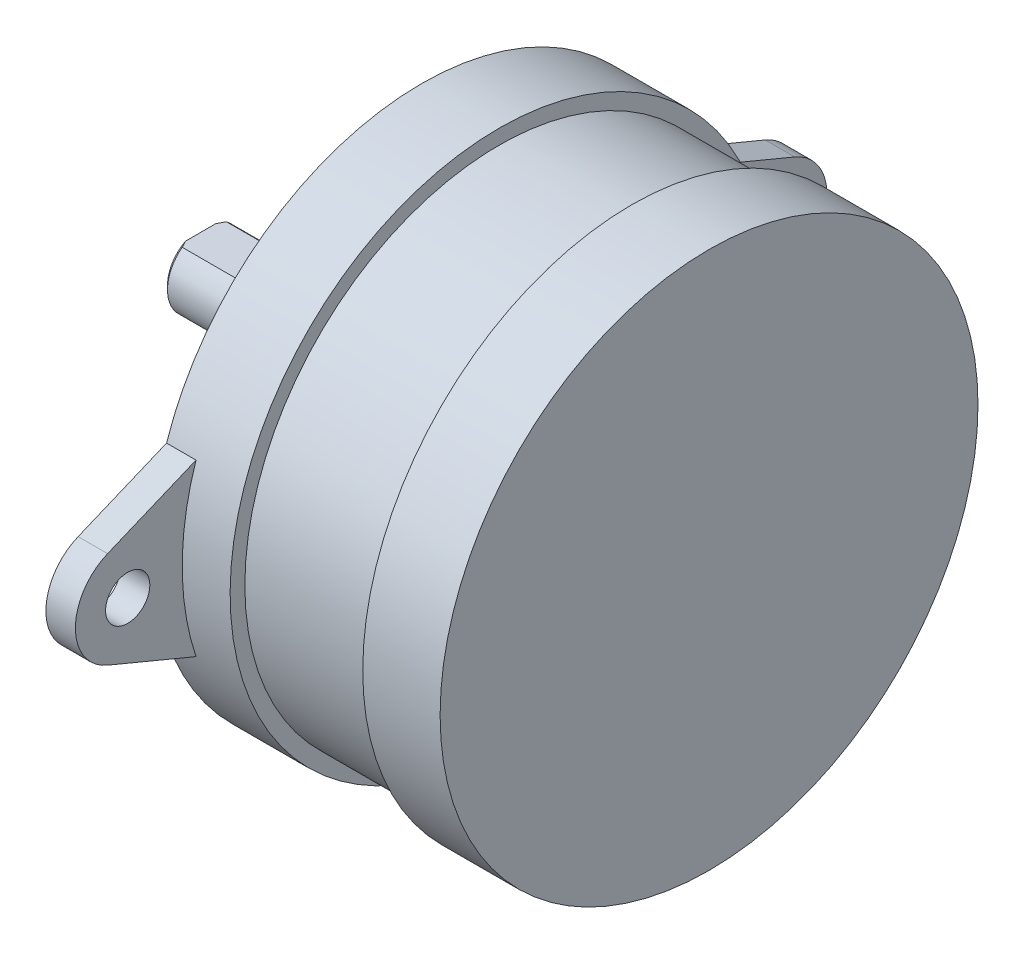
ISO-10303-21;
HEADER;
FILE_DESCRIPTION(('STEP AP214'),'2;1');
FILE_NAME('part.step','',(''),(''),'','','');
FILE_SCHEMA(('AUTOMOTIVE_DESIGN { 1 0 10303 214 1 1 1 1 }'));
ENDSEC;
DATA;
#1=APPLICATION_CONTEXT('core data for automotive mechanical design processes');
#2=APPLICATION_PROTOCOL_DEFINITION('international standard','automotive_design',2000,#1);
#3=PRODUCT_CONTEXT('',#1,'mechanical');
#4=PRODUCT('Part','Part','',(#3));
#5=PRODUCT_RELATED_PRODUCT_CATEGORY('part','',(#4));
#6=PRODUCT_DEFINITION_FORMATION('','',#4);
#7=PRODUCT_DEFINITION_CONTEXT('part definition',#1,'design');
#8=PRODUCT_DEFINITION('design','',#6,#7);
#9=PRODUCT_DEFINITION_SHAPE('','',#8);
#10=(LENGTH_UNIT() NAMED_UNIT(*) SI_UNIT(.MILLI.,.METRE.));
#11=(NAMED_UNIT(*) PLANE_ANGLE_UNIT() SI_UNIT($,.RADIAN.));
#12=(NAMED_UNIT(*) SI_UNIT($,.STERADIAN.) SOLID_ANGLE_UNIT());
#13=UNCERTAINTY_MEASURE_WITH_UNIT(LENGTH_MEASURE(1.E-05),#10,'distance_accuracy_value','');
#14=(GEOMETRIC_REPRESENTATION_CONTEXT(3) GLOBAL_UNCERTAINTY_ASSIGNED_CONTEXT((#13)) GLOBAL_UNIT_ASSIGNED_CONTEXT((#10,
#11,#12)) REPRESENTATION_CONTEXT('',''));
#15=CARTESIAN_POINT('',(0.,0.,0.));
#16=DIRECTION('',(0.,0.,1.));
#17=DIRECTION('',(1.,0.,0.));
#18=AXIS2_PLACEMENT_3D('',#15,#16,#17);
#19=CARTESIAN_POINT('',(5.25,0.,0.));
#20=DIRECTION('',(-1.,0.,0.));
#21=DIRECTION('',(0.,0.,1.));
#22=AXIS2_PLACEMENT_3D('',#19,#20,#21);
#23=CYLINDRICAL_SURFACE('',#22,18.25);
#24=CARTESIAN_POINT('',(5.25,0.,0.));
#25=DIRECTION('',(1.,0.,0.));
#26=DIRECTION('',(0.,0.,-1.));
#27=AXIS2_PLACEMENT_3D('',#24,#25,#26);
#28=CIRCLE('',#27,18.25);
#29=CARTESIAN_POINT('',(5.25,0.,-18.25));
#30=VERTEX_POINT('',#29);
#31=EDGE_CURVE('E233',#30,#30,#28,.T.);
#32=ORIENTED_EDGE('',*,*,#31,.F.);
#33=EDGE_LOOP('',(#32));
#34=FACE_BOUND('',#33,.T.);
#35=DIRECTION('',(-1.,0.,0.));
#36=VECTOR('',#35,1.);
#37=CARTESIAN_POINT('',(2.,5.77449333336406,-17.3123576309795));
#38=LINE('',#37,#36);
#39=CARTESIAN_POINT('',(2.,5.77449333336406,-17.3123576309795));
#40=VERTEX_POINT('',#39);
#41=CARTESIAN_POINT('',(0.,5.77449333336406,-17.3123576309795));
#42=VERTEX_POINT('',#41);
#43=EDGE_CURVE('E236',#40,#42,#38,.T.);
#44=ORIENTED_EDGE('',*,*,#43,.T.);
#45=CARTESIAN_POINT('',(0.,0.,0.));
#46=DIRECTION('',(1.,0.,0.));
#47=DIRECTION('',(0.,0.,-1.));
#48=AXIS2_PLACEMENT_3D('',#45,#46,#47);
#49=CIRCLE('',#48,18.25);
#50=CARTESIAN_POINT('',(0.,5.77449333336406,17.3123576309795));
#51=VERTEX_POINT('',#50);
#52=EDGE_CURVE('E238',#42,#51,#49,.T.);
#53=ORIENTED_EDGE('',*,*,#52,.T.);
#54=DIRECTION('',(-1.,0.,0.));
#55=VECTOR('',#54,1.);
#56=CARTESIAN_POINT('',(2.,5.77449333336406,17.3123576309795));
#57=LINE('',#56,#55);
#58=CARTESIAN_POINT('',(2.,5.77449333336406,17.3123576309795));
#59=VERTEX_POINT('',#58);
#60=EDGE_CURVE('E302',#59,#51,#57,.T.);
#61=ORIENTED_EDGE('',*,*,#60,.F.);
#62=CARTESIAN_POINT('',(2.,0.,0.));
#63=DIRECTION('',(-1.,0.,0.));
#64=DIRECTION('',(0.,0.,1.));
#65=AXIS2_PLACEMENT_3D('',#62,#63,#64);
#66=CIRCLE('',#65,18.25);
#67=CARTESIAN_POINT('',(2.,-5.77449333336406,17.3123576309795));
#68=VERTEX_POINT('',#67);
#69=EDGE_CURVE('E275',#68,#59,#66,.T.);
#70=ORIENTED_EDGE('',*,*,#69,.F.);
#71=DIRECTION('',(-1.,0.,0.));
#72=VECTOR('',#71,1.);
#73=CARTESIAN_POINT('',(2.,-5.77449333336406,17.3123576309795));
#74=LINE('',#73,#72);
#75=CARTESIAN_POINT('',(0.,-5.77449333336406,17.3123576309795));
#76=VERTEX_POINT('',#75);
#77=EDGE_CURVE('E299',#68,#76,#74,.T.);
#78=ORIENTED_EDGE('',*,*,#77,.T.);
#79=CARTESIAN_POINT('',(0.,-5.77449333336406,-17.3123576309795));
#80=VERTEX_POINT('',#79);
#81=EDGE_CURVE('E315',#76,#80,#49,.T.);
#82=ORIENTED_EDGE('',*,*,#81,.T.);
#83=DIRECTION('',(-1.,0.,0.));
#84=VECTOR('',#83,1.);
#85=CARTESIAN_POINT('',(2.,-5.77449333336406,-17.3123576309795));
#86=LINE('',#85,#84);
#87=CARTESIAN_POINT('',(2.,-5.77449333336406,-17.3123576309795));
#88=VERTEX_POINT('',#87);
#89=EDGE_CURVE('E58',#88,#80,#86,.T.);
#90=ORIENTED_EDGE('',*,*,#89,.F.);
#91=CARTESIAN_POINT('',(2.,0.,0.));
#92=DIRECTION('',(-1.,0.,0.));
#93=DIRECTION('',(0.,0.,1.));
#94=AXIS2_PLACEMENT_3D('',#91,#92,#93);
#95=CIRCLE('',#94,18.25);
#96=EDGE_CURVE('E240',#40,#88,#95,.T.);
#97=ORIENTED_EDGE('',*,*,#96,.F.);
#98=EDGE_LOOP('',(#44,#53,#61,#70,#78,#82,#90,#97));
#99=FACE_BOUND('',#98,.T.);
#100=ADVANCED_FACE('F34',(#34,#99),#23,.T.);
#101=CARTESIAN_POINT('',(5.25,0.,0.));
#102=DIRECTION('',(1.,0.,0.));
#103=DIRECTION('',(0.,0.,-1.));
#104=AXIS2_PLACEMENT_3D('',#101,#102,#103);
#105=PLANE('',#104);
#106=CARTESIAN_POINT('',(5.25,0.,0.));
#107=DIRECTION('',(1.,0.,0.));
#108=DIRECTION('',(0.,0.,-1.));
#109=AXIS2_PLACEMENT_3D('',#106,#107,#108);
#110=CIRCLE('',#109,17.25);
#111=CARTESIAN_POINT('',(5.25,0.,-17.25));
#112=VERTEX_POINT('',#111);
#113=EDGE_CURVE('E136',#112,#112,#110,.T.);
#114=ORIENTED_EDGE('',*,*,#113,.F.);
#115=EDGE_LOOP('',(#114));
#116=FACE_BOUND('',#115,.T.);
#117=ORIENTED_EDGE('',*,*,#31,.T.);
#118=EDGE_LOOP('',(#117));
#119=FACE_BOUND('',#118,.T.);
#120=ADVANCED_FACE('F221',(#116,#119),#105,.T.);
#121=CARTESIAN_POINT('',(0.,0.,0.));
#122=DIRECTION('',(1.,0.,0.));
#123=DIRECTION('',(0.,0.,-1.));
#124=AXIS2_PLACEMENT_3D('',#121,#122,#123);
#125=PLANE('',#124);
#126=CARTESIAN_POINT('',(0.,0.,0.));
#127=DIRECTION('',(-1.,0.,0.));
#128=DIRECTION('',(0.,0.,1.));
#129=AXIS2_PLACEMENT_3D('',#126,#127,#128);
#130=CIRCLE('',#129,8.);
#131=CARTESIAN_POINT('',(0.,0.,8.));
#132=VERTEX_POINT('',#131);
#133=EDGE_CURVE('E132',#132,#132,#130,.T.);
#134=ORIENTED_EDGE('',*,*,#133,.F.);
#135=EDGE_LOOP('',(#134));
#136=FACE_BOUND('',#135,.T.);
#137=ORIENTED_EDGE('',*,*,#81,.F.);
#138=DIRECTION('',(0.,-0.384131557483133,-0.92327836893625));
#139=VECTOR('',#138,1.);
#140=CARTESIAN_POINT('',(0.,-11.0624330645305,4.60254435238959));
#141=LINE('',#140,#139);
#142=CARTESIAN_POINT('',(0.,-3.27763820972369,23.3136670290651));
#143=VERTEX_POINT('',#142);
#144=EDGE_CURVE('E290',#143,#76,#141,.T.);
#145=ORIENTED_EDGE('',*,*,#144,.F.);
#146=CARTESIAN_POINT('',(0.,0.,21.95));
#147=DIRECTION('',(-1.,0.,0.));
#148=DIRECTION('',(0.,0.,1.));
#149=AXIS2_PLACEMENT_3D('',#146,#147,#148);
#150=CIRCLE('',#149,3.55);
#151=CARTESIAN_POINT('',(0.,3.27763820972369,23.3136670290651));
#152=VERTEX_POINT('',#151);
#153=EDGE_CURVE('E243',#152,#143,#150,.F.);
#154=ORIENTED_EDGE('',*,*,#153,.F.);
#155=DIRECTION('',(0.,0.384131557483133,-0.92327836893625));
#156=VECTOR('',#155,1.);
#157=CARTESIAN_POINT('',(0.,11.0624330645305,4.60254435238959));
#158=LINE('',#157,#156);
#159=EDGE_CURVE('E287',#152,#51,#158,.T.);
#160=ORIENTED_EDGE('',*,*,#159,.T.);
#161=ORIENTED_EDGE('',*,*,#52,.F.);
#162=DIRECTION('',(0.,0.384131557483133,0.92327836893625));
#163=VECTOR('',#162,1.);
#164=CARTESIAN_POINT('',(0.,11.0624330645305,-4.60254435238959));
#165=LINE('',#164,#163);
#166=CARTESIAN_POINT('',(0.,3.27763820972369,-23.3136670290651));
#167=VERTEX_POINT('',#166);
#168=EDGE_CURVE('E246',#167,#42,#165,.T.);
#169=ORIENTED_EDGE('',*,*,#168,.F.);
#170=CARTESIAN_POINT('',(0.,0.,-21.95));
#171=DIRECTION('',(-1.,0.,0.));
#172=DIRECTION('',(0.,0.,1.));
#173=AXIS2_PLACEMENT_3D('',#170,#171,#172);
#174=CIRCLE('',#173,3.55);
#175=CARTESIAN_POINT('',(0.,-3.27763820972369,-23.3136670290651));
#176=VERTEX_POINT('',#175);
#177=EDGE_CURVE('E251',#167,#176,#174,.T.);
#178=ORIENTED_EDGE('',*,*,#177,.T.);
#179=DIRECTION('',(0.,-0.384131557483133,0.92327836893625));
#180=VECTOR('',#179,1.);
#181=CARTESIAN_POINT('',(0.,-11.0624330645305,-4.60254435238959));
#182=LINE('',#181,#180);
#183=EDGE_CURVE('E254',#176,#80,#182,.T.);
#184=ORIENTED_EDGE('',*,*,#183,.T.);
#185=EDGE_LOOP('',(#137,#145,#154,#160,#161,#169,#178,#184));
#186=FACE_BOUND('',#185,.T.);
#187=CARTESIAN_POINT('',(0.,0.,21.95));
#188=DIRECTION('',(-1.,0.,0.));
#189=DIRECTION('',(0.,0.,1.));
#190=AXIS2_PLACEMENT_3D('',#187,#188,#189);
#191=CIRCLE('',#190,1.5);
#192=CARTESIAN_POINT('',(0.,0.,23.45));
#193=VERTEX_POINT('',#192);
#194=EDGE_CURVE('E272',#193,#193,#191,.T.);
#195=ORIENTED_EDGE('',*,*,#194,.F.);
#196=EDGE_LOOP('',(#195));
#197=FACE_BOUND('',#196,.T.);
#198=CARTESIAN_POINT('',(0.,0.,-21.95));
#199=DIRECTION('',(-1.,0.,0.));
#200=DIRECTION('',(0.,0.,1.));
#201=AXIS2_PLACEMENT_3D('',#198,#199,#200);
#202=CIRCLE('',#201,1.5);
#203=CARTESIAN_POINT('',(0.,0.,-20.45));
#204=VERTEX_POINT('',#203);
#205=EDGE_CURVE('E252',#204,#204,#202,.F.);
#206=ORIENTED_EDGE('',*,*,#205,.T.);
#207=EDGE_LOOP('',(#206));
#208=FACE_BOUND('',#207,.T.);
#209=ADVANCED_FACE('F219',(#136,#186,#197,#208),#125,.F.);
#210=CARTESIAN_POINT('',(14.25,0.,0.));
#211=DIRECTION('',(-1.,0.,0.));
#212=DIRECTION('',(0.,0.,1.));
#213=AXIS2_PLACEMENT_3D('',#210,#211,#212);
#214=CYLINDRICAL_SURFACE('',#213,17.25);
#215=CARTESIAN_POINT('',(14.25,0.,0.));
#216=DIRECTION('',(1.,0.,0.));
#217=DIRECTION('',(0.,0.,-1.));
#218=AXIS2_PLACEMENT_3D('',#215,#216,#217);
#219=CIRCLE('',#218,17.25);
#220=CARTESIAN_POINT('',(14.25,0.,-17.25));
#221=VERTEX_POINT('',#220);
#222=EDGE_CURVE('E308',#221,#221,#219,.T.);
#223=ORIENTED_EDGE('',*,*,#222,.F.);
#224=EDGE_LOOP('',(#223));
#225=FACE_BOUND('',#224,.T.);
#226=ORIENTED_EDGE('',*,*,#113,.T.);
#227=EDGE_LOOP('',(#226));
#228=FACE_BOUND('',#227,.T.);
#229=ADVANCED_FACE('F215',(#225,#228),#214,.T.);
#230=CARTESIAN_POINT('',(19.5,0.,0.));
#231=DIRECTION('',(-1.,0.,0.));
#232=DIRECTION('',(0.,0.,1.));
#233=AXIS2_PLACEMENT_3D('',#230,#231,#232);
#234=CYLINDRICAL_SURFACE('',#233,18.25);
#235=CARTESIAN_POINT('',(19.5,0.,0.));
#236=DIRECTION('',(1.,0.,0.));
#237=DIRECTION('',(0.,0.,-1.));
#238=AXIS2_PLACEMENT_3D('',#235,#236,#237);
#239=CIRCLE('',#238,18.25);
#240=CARTESIAN_POINT('',(19.5,0.,18.25));
#241=VERTEX_POINT('',#240);
#242=EDGE_CURVE('E305',#241,#241,#239,.T.);
#243=CARTESIAN_POINT('',(14.25,0.,0.));
#244=DIRECTION('',(1.,0.,0.));
#245=DIRECTION('',(0.,0.,-1.));
#246=AXIS2_PLACEMENT_3D('',#243,#244,#245);
#247=CIRCLE('',#246,18.25);
#248=CARTESIAN_POINT('',(14.25,0.,18.25));
#249=VERTEX_POINT('',#248);
#250=EDGE_CURVE('E298',#249,#249,#247,.T.);
#251=CARTESIAN_POINT('',(19.5,0.,18.25));
#252=CARTESIAN_POINT('',(19.4453125,0.,18.25));
#253=CARTESIAN_POINT('',(19.390625,0.,18.25));
#254=CARTESIAN_POINT('',(19.28125,0.,18.25));
#255=CARTESIAN_POINT('',(19.2265625,0.,18.25));
#256=CARTESIAN_POINT('',(19.1171875,0.,18.25));
#257=CARTESIAN_POINT('',(19.0625,0.,18.25));
#258=CARTESIAN_POINT('',(18.953125,0.,18.25));
#259=CARTESIAN_POINT('',(18.8984375,0.,18.25));
#260=CARTESIAN_POINT('',(18.7890625,0.,18.25));
#261=CARTESIAN_POINT('',(18.734375,0.,18.25));
#262=CARTESIAN_POINT('',(18.625,0.,18.25));
#263=CARTESIAN_POINT('',(18.5703125,0.,18.25));
#264=CARTESIAN_POINT('',(18.4609375,0.,18.25));
#265=CARTESIAN_POINT('',(18.40625,0.,18.25));
#266=CARTESIAN_POINT('',(18.296875,0.,18.25));
#267=CARTESIAN_POINT('',(18.2421875,0.,18.25));
#268=CARTESIAN_POINT('',(18.1328125,0.,18.25));
#269=CARTESIAN_POINT('',(18.078125,0.,18.25));
#270=CARTESIAN_POINT('',(17.96875,0.,18.25));
#271=CARTESIAN_POINT('',(17.9140625,0.,18.25));
#272=CARTESIAN_POINT('',(17.8046875,0.,18.25));
#273=CARTESIAN_POINT('',(17.75,0.,18.25));
#274=CARTESIAN_POINT('',(17.640625,0.,18.25));
#275=CARTESIAN_POINT('',(17.5859375,0.,18.25));
#276=CARTESIAN_POINT('',(17.4765625,0.,18.25));
#277=CARTESIAN_POINT('',(17.421875,0.,18.25));
#278=CARTESIAN_POINT('',(17.3125,0.,18.25));
#279=CARTESIAN_POINT('',(17.2578125,0.,18.25));
#280=CARTESIAN_POINT('',(17.1484375,0.,18.25));
#281=CARTESIAN_POINT('',(17.09375,0.,18.25));
#282=CARTESIAN_POINT('',(16.984375,0.,18.25));
#283=CARTESIAN_POINT('',(16.9296875,0.,18.25));
#284=CARTESIAN_POINT('',(16.8203125,0.,18.25));
#285=CARTESIAN_POINT('',(16.765625,0.,18.25));
#286=CARTESIAN_POINT('',(16.65625,0.,18.25));
#287=CARTESIAN_POINT('',(16.6015625,0.,18.25));
#288=CARTESIAN_POINT('',(16.4921875,0.,18.25));
#289=CARTESIAN_POINT('',(16.4375,0.,18.25));
#290=CARTESIAN_POINT('',(16.328125,0.,18.25));
#291=CARTESIAN_POINT('',(16.2734375,0.,18.25));
#292=CARTESIAN_POINT('',(16.1640625,0.,18.25));
#293=CARTESIAN_POINT('',(16.109375,0.,18.25));
#294=CARTESIAN_POINT('',(16.,0.,18.25));
#295=CARTESIAN_POINT('',(15.9453125,0.,18.25));
#296=CARTESIAN_POINT('',(15.8359375,0.,18.25));
#297=CARTESIAN_POINT('',(15.78125,0.,18.25));
#298=CARTESIAN_POINT('',(15.671875,0.,18.25));
#299=CARTESIAN_POINT('',(15.6171875,0.,18.25));
#300=CARTESIAN_POINT('',(15.5078125,0.,18.25));
#301=CARTESIAN_POINT('',(15.453125,0.,18.25));
#302=CARTESIAN_POINT('',(15.34375,0.,18.25));
#303=CARTESIAN_POINT('',(15.2890625,0.,18.25));
#304=CARTESIAN_POINT('',(15.1796875,0.,18.25));
#305=CARTESIAN_POINT('',(15.125,0.,18.25));
#306=CARTESIAN_POINT('',(15.015625,0.,18.25));
#307=CARTESIAN_POINT('',(14.9609375,0.,18.25));
#308=CARTESIAN_POINT('',(14.8515625,0.,18.25));
#309=CARTESIAN_POINT('',(14.796875,0.,18.25));
#310=CARTESIAN_POINT('',(14.6875,0.,18.25));
#311=CARTESIAN_POINT('',(14.6328125,0.,18.25));
#312=CARTESIAN_POINT('',(14.5234375,0.,18.25));
#313=CARTESIAN_POINT('',(14.46875,0.,18.25));
#314=CARTESIAN_POINT('',(14.359375,0.,18.25));
#315=CARTESIAN_POINT('',(14.3046875,0.,18.25));
#316=CARTESIAN_POINT('',(14.25,0.,18.25));
#317=B_SPLINE_CURVE_WITH_KNOTS('',3,(#251,#252,#253,#254,#255,#256,#257,#258,#259,#260,#261,
#262,#263,#264,#265,#266,#267,#268,#269,#270,#271,#272,#273,#274,#275,#276,#277,#278,#279,#280,
#281,#282,#283,#284,#285,#286,#287,#288,#289,#290,#291,#292,#293,#294,#295,#296,#297,#298,#299,
#300,#301,#302,#303,#304,#305,#306,#307,#308,#309,#310,#311,#312,#313,#314,#315,#316),
.UNSPECIFIED.,.F.,.F.,(4,2,2,2,2,2,2,2,2,2,2,2,2,2,2,2,2,2,2,2,2,2,2,2,2,2,2,2,2,2,2,2,4),(0.,
0.164062499999999,0.328124999999999,0.492187499999998,0.656249999999997,0.8203125,
0.984374999999999,1.1484375,1.3125,1.4765625,1.640625,1.8046875,1.96875,2.1328125,2.296875,
2.4609375,2.625,2.7890625,2.953125,3.1171875,3.28125,3.4453125,3.609375,3.7734375,3.9375,
4.1015625,4.265625,4.4296875,4.59375,4.7578125,4.921875,5.0859375,5.25),.UNSPECIFIED.);
#318=EDGE_CURVE('BSEAM208',#241,#249,#317,.T.);
#319=ORIENTED_EDGE('',*,*,#242,.F.);
#320=ORIENTED_EDGE('',*,*,#250,.T.);
#321=ORIENTED_EDGE('',*,*,#318,.T.);
#322=ORIENTED_EDGE('',*,*,#318,.F.);
#323=EDGE_LOOP('',(#319,#321,#320,#322));
#324=FACE_BOUND('',#323,.T.);
#325=ADVANCED_FACE('F208',(#324),#234,.T.);
#326=CARTESIAN_POINT('',(19.5,0.,0.));
#327=DIRECTION('',(1.,0.,0.));
#328=DIRECTION('',(0.,0.,-1.));
#329=AXIS2_PLACEMENT_3D('',#326,#327,#328);
#330=PLANE('',#329);
#331=ORIENTED_EDGE('',*,*,#242,.T.);
#332=EDGE_LOOP('',(#331));
#333=FACE_BOUND('',#332,.T.);
#334=ADVANCED_FACE('F205',(#333),#330,.T.);
#335=CARTESIAN_POINT('',(14.25,0.,0.));
#336=DIRECTION('',(1.,0.,0.));
#337=DIRECTION('',(0.,0.,-1.));
#338=AXIS2_PLACEMENT_3D('',#335,#336,#337);
#339=PLANE('',#338);
#340=ORIENTED_EDGE('',*,*,#222,.T.);
#341=EDGE_LOOP('',(#340));
#342=FACE_BOUND('',#341,.T.);
#343=ORIENTED_EDGE('',*,*,#250,.F.);
#344=EDGE_LOOP('',(#343));
#345=FACE_BOUND('',#344,.T.);
#346=ADVANCED_FACE('F203',(#342,#345),#339,.F.);
#347=CARTESIAN_POINT('',(2.,0.,21.95));
#348=DIRECTION('',(-1.,0.,0.));
#349=DIRECTION('',(0.,0.,1.));
#350=AXIS2_PLACEMENT_3D('',#347,#348,#349);
#351=CYLINDRICAL_SURFACE('',#350,3.55);
#352=ORIENTED_EDGE('',*,*,#153,.T.);
#353=DIRECTION('',(-1.,0.,0.));
#354=VECTOR('',#353,1.);
#355=CARTESIAN_POINT('',(2.,-3.27763820972369,23.3136670290651));
#356=LINE('',#355,#354);
#357=CARTESIAN_POINT('',(2.,-3.27763820972369,23.3136670290651));
#358=VERTEX_POINT('',#357);
#359=EDGE_CURVE('E295',#358,#143,#356,.T.);
#360=ORIENTED_EDGE('',*,*,#359,.F.);
#361=CARTESIAN_POINT('',(2.,0.,21.95));
#362=DIRECTION('',(-1.,0.,0.));
#363=DIRECTION('',(0.,0.,1.));
#364=AXIS2_PLACEMENT_3D('',#361,#362,#363);
#365=CIRCLE('',#364,3.55);
#366=CARTESIAN_POINT('',(2.,3.27763820972369,23.3136670290651));
#367=VERTEX_POINT('',#366);
#368=EDGE_CURVE('E268',#367,#358,#365,.F.);
#369=ORIENTED_EDGE('',*,*,#368,.F.);
#370=DIRECTION('',(-1.,0.,0.));
#371=VECTOR('',#370,1.);
#372=CARTESIAN_POINT('',(2.,3.27763820972369,23.3136670290651));
#373=LINE('',#372,#371);
#374=EDGE_CURVE('E284',#367,#152,#373,.T.);
#375=ORIENTED_EDGE('',*,*,#374,.T.);
#376=EDGE_LOOP('',(#352,#360,#369,#375));
#377=FACE_BOUND('',#376,.T.);
#378=ADVANCED_FACE('F196',(#377),#351,.T.);
#379=CARTESIAN_POINT('',(2.,-11.0624330645305,4.60254435238959));
#380=DIRECTION('',(0.,0.92327836893625,-0.384131557483133));
#381=DIRECTION('',(0.,0.384131557483133,0.92327836893625));
#382=AXIS2_PLACEMENT_3D('',#379,#380,#381);
#383=PLANE('',#382);
#384=ORIENTED_EDGE('',*,*,#144,.T.);
#385=ORIENTED_EDGE('',*,*,#77,.F.);
#386=DIRECTION('',(0.,-0.384131557483133,-0.92327836893625));
#387=VECTOR('',#386,1.);
#388=CARTESIAN_POINT('',(2.,-11.0624330645305,4.60254435238959));
#389=LINE('',#388,#387);
#390=EDGE_CURVE('E278',#358,#68,#389,.T.);
#391=ORIENTED_EDGE('',*,*,#390,.F.);
#392=ORIENTED_EDGE('',*,*,#359,.T.);
#393=EDGE_LOOP('',(#384,#385,#391,#392));
#394=FACE_BOUND('',#393,.T.);
#395=ADVANCED_FACE('F193',(#394),#383,.F.);
#396=CARTESIAN_POINT('',(2.,11.0624330645305,4.60254435238959));
#397=DIRECTION('',(0.,0.92327836893625,0.384131557483133));
#398=DIRECTION('',(0.,-0.384131557483133,0.92327836893625));
#399=AXIS2_PLACEMENT_3D('',#396,#397,#398);
#400=PLANE('',#399);
#401=ORIENTED_EDGE('',*,*,#159,.F.);
#402=ORIENTED_EDGE('',*,*,#374,.F.);
#403=DIRECTION('',(0.,0.384131557483133,-0.92327836893625));
#404=VECTOR('',#403,1.);
#405=CARTESIAN_POINT('',(2.,11.0624330645305,4.60254435238959));
#406=LINE('',#405,#404);
#407=EDGE_CURVE('E271',#367,#59,#406,.T.);
#408=ORIENTED_EDGE('',*,*,#407,.T.);
#409=ORIENTED_EDGE('',*,*,#60,.T.);
#410=EDGE_LOOP('',(#401,#402,#408,#409));
#411=FACE_BOUND('',#410,.T.);
#412=ADVANCED_FACE('F191',(#411),#400,.T.);
#413=CARTESIAN_POINT('',(2.,0.,21.95));
#414=DIRECTION('',(-1.,0.,0.));
#415=DIRECTION('',(0.,0.,1.));
#416=AXIS2_PLACEMENT_3D('',#413,#414,#415);
#417=CYLINDRICAL_SURFACE('',#416,1.5);
#418=CARTESIAN_POINT('',(2.,0.,21.95));
#419=DIRECTION('',(-1.,0.,0.));
#420=DIRECTION('',(0.,0.,1.));
#421=AXIS2_PLACEMENT_3D('',#418,#419,#420);
#422=CIRCLE('',#421,1.5);
#423=CARTESIAN_POINT('',(2.,0.,23.45));
#424=VERTEX_POINT('',#423);
#425=EDGE_CURVE('E281',#424,#424,#422,.T.);
#426=ORIENTED_EDGE('',*,*,#425,.F.);
#427=EDGE_LOOP('',(#426));
#428=FACE_BOUND('',#427,.T.);
#429=ORIENTED_EDGE('',*,*,#194,.T.);
#430=EDGE_LOOP('',(#429));
#431=FACE_BOUND('',#430,.T.);
#432=ADVANCED_FACE('F187',(#428,#431),#417,.F.);
#433=CARTESIAN_POINT('',(2.,0.,0.));
#434=DIRECTION('',(-1.,0.,0.));
#435=DIRECTION('',(0.,0.,1.));
#436=AXIS2_PLACEMENT_3D('',#433,#434,#435);
#437=PLANE('',#436);
#438=ORIENTED_EDGE('',*,*,#368,.T.);
#439=ORIENTED_EDGE('',*,*,#390,.T.);
#440=ORIENTED_EDGE('',*,*,#69,.T.);
#441=ORIENTED_EDGE('',*,*,#407,.F.);
#442=EDGE_LOOP('',(#438,#439,#440,#441));
#443=FACE_BOUND('',#442,.T.);
#444=ORIENTED_EDGE('',*,*,#425,.T.);
#445=EDGE_LOOP('',(#444));
#446=FACE_BOUND('',#445,.T.);
#447=ADVANCED_FACE('F180',(#443,#446),#437,.F.);
#448=CARTESIAN_POINT('',(2.,11.0624330645305,-4.60254435238959));
#449=DIRECTION('',(0.,-0.92327836893625,0.384131557483133));
#450=DIRECTION('',(0.,-0.384131557483133,-0.92327836893625));
#451=AXIS2_PLACEMENT_3D('',#448,#449,#450);
#452=PLANE('',#451);
#453=ORIENTED_EDGE('',*,*,#168,.T.);
#454=ORIENTED_EDGE('',*,*,#43,.F.);
#455=DIRECTION('',(0.,0.384131557483133,0.92327836893625));
#456=VECTOR('',#455,1.);
#457=CARTESIAN_POINT('',(2.,11.0624330645305,-4.60254435238959));
#458=LINE('',#457,#456);
#459=CARTESIAN_POINT('',(2.,3.27763820972369,-23.3136670290651));
#460=VERTEX_POINT('',#459);
#461=EDGE_CURVE('E327',#460,#40,#458,.T.);
#462=ORIENTED_EDGE('',*,*,#461,.F.);
#463=DIRECTION('',(-1.,0.,0.));
#464=VECTOR('',#463,1.);
#465=CARTESIAN_POINT('',(2.,3.27763820972369,-23.3136670290651));
#466=LINE('',#465,#464);
#467=EDGE_CURVE('E247',#460,#167,#466,.T.);
#468=ORIENTED_EDGE('',*,*,#467,.T.);
#469=EDGE_LOOP('',(#453,#454,#462,#468));
#470=FACE_BOUND('',#469,.T.);
#471=ADVANCED_FACE('F173',(#470),#452,.F.);
#472=CARTESIAN_POINT('',(2.,-11.0624330645305,-4.60254435238959));
#473=DIRECTION('',(0.,-0.92327836893625,-0.384131557483133));
#474=DIRECTION('',(0.,0.384131557483133,-0.92327836893625));
#475=AXIS2_PLACEMENT_3D('',#472,#473,#474);
#476=PLANE('',#475);
#477=ORIENTED_EDGE('',*,*,#183,.F.);
#478=DIRECTION('',(-1.,0.,0.));
#479=VECTOR('',#478,1.);
#480=CARTESIAN_POINT('',(2.,-3.27763820972369,-23.3136670290651));
#481=LINE('',#480,#479);
#482=CARTESIAN_POINT('',(2.,-3.27763820972369,-23.3136670290651));
#483=VERTEX_POINT('',#482);
#484=EDGE_CURVE('E265',#483,#176,#481,.T.);
#485=ORIENTED_EDGE('',*,*,#484,.F.);
#486=DIRECTION('',(0.,-0.384131557483133,0.92327836893625));
#487=VECTOR('',#486,1.);
#488=CARTESIAN_POINT('',(2.,-11.0624330645305,-4.60254435238959));
#489=LINE('',#488,#487);
#490=EDGE_CURVE('E320',#483,#88,#489,.T.);
#491=ORIENTED_EDGE('',*,*,#490,.T.);
#492=ORIENTED_EDGE('',*,*,#89,.T.);
#493=EDGE_LOOP('',(#477,#485,#491,#492));
#494=FACE_BOUND('',#493,.T.);
#495=ADVANCED_FACE('F169',(#494),#476,.T.);
#496=CARTESIAN_POINT('',(2.,0.,-21.95));
#497=DIRECTION('',(-1.,0.,0.));
#498=DIRECTION('',(0.,0.,1.));
#499=AXIS2_PLACEMENT_3D('',#496,#497,#498);
#500=CYLINDRICAL_SURFACE('',#499,1.5);
#501=CARTESIAN_POINT('',(2.,0.,-21.95));
#502=DIRECTION('',(-1.,0.,0.));
#503=DIRECTION('',(0.,0.,1.));
#504=AXIS2_PLACEMENT_3D('',#501,#502,#503);
#505=CIRCLE('',#504,1.5);
#506=CARTESIAN_POINT('',(2.,0.,-20.45));
#507=VERTEX_POINT('',#506);
#508=EDGE_CURVE('E262',#507,#507,#505,.F.);
#509=ORIENTED_EDGE('',*,*,#508,.T.);
#510=EDGE_LOOP('',(#509));
#511=FACE_BOUND('',#510,.T.);
#512=ORIENTED_EDGE('',*,*,#205,.F.);
#513=EDGE_LOOP('',(#512));
#514=FACE_BOUND('',#513,.T.);
#515=ADVANCED_FACE('F172',(#511,#514),#500,.F.);
#516=CARTESIAN_POINT('',(2.,0.,-21.95));
#517=DIRECTION('',(-1.,0.,0.));
#518=DIRECTION('',(0.,0.,1.));
#519=AXIS2_PLACEMENT_3D('',#516,#517,#518);
#520=CYLINDRICAL_SURFACE('',#519,3.55);
#521=ORIENTED_EDGE('',*,*,#177,.F.);
#522=ORIENTED_EDGE('',*,*,#467,.F.);
#523=CARTESIAN_POINT('',(2.,0.,-21.95));
#524=DIRECTION('',(-1.,0.,0.));
#525=DIRECTION('',(0.,0.,1.));
#526=AXIS2_PLACEMENT_3D('',#523,#524,#525);
#527=CIRCLE('',#526,3.55);
#528=EDGE_CURVE('E324',#460,#483,#527,.T.);
#529=ORIENTED_EDGE('',*,*,#528,.T.);
#530=ORIENTED_EDGE('',*,*,#484,.T.);
#531=EDGE_LOOP('',(#521,#522,#529,#530));
#532=FACE_BOUND('',#531,.T.);
#533=ADVANCED_FACE('F167',(#532),#520,.T.);
#534=CARTESIAN_POINT('',(2.,0.,0.));
#535=DIRECTION('',(-1.,0.,0.));
#536=DIRECTION('',(0.,0.,1.));
#537=AXIS2_PLACEMENT_3D('',#534,#535,#536);
#538=PLANE('',#537);
#539=ORIENTED_EDGE('',*,*,#508,.F.);
#540=EDGE_LOOP('',(#539));
#541=FACE_BOUND('',#540,.T.);
#542=ORIENTED_EDGE('',*,*,#461,.T.);
#543=ORIENTED_EDGE('',*,*,#96,.T.);
#544=ORIENTED_EDGE('',*,*,#490,.F.);
#545=ORIENTED_EDGE('',*,*,#528,.F.);
#546=EDGE_LOOP('',(#542,#543,#544,#545));
#547=FACE_BOUND('',#546,.T.);
#548=ADVANCED_FACE('F163',(#541,#547),#538,.F.);
#549=CARTESIAN_POINT('',(-2.,0.,0.));
#550=DIRECTION('',(1.,0.,0.));
#551=DIRECTION('',(0.,0.,-1.));
#552=AXIS2_PLACEMENT_3D('',#549,#550,#551);
#553=CYLINDRICAL_SURFACE('',#552,8.);
#554=CARTESIAN_POINT('',(-2.,0.,0.));
#555=DIRECTION('',(-1.,0.,0.));
#556=DIRECTION('',(0.,0.,1.));
#557=AXIS2_PLACEMENT_3D('',#554,#555,#556);
#558=CIRCLE('',#557,8.);
#559=CARTESIAN_POINT('',(-2.,0.,8.));
#560=VERTEX_POINT('',#559);
#561=EDGE_CURVE('E257',#560,#560,#558,.T.);
#562=ORIENTED_EDGE('',*,*,#561,.F.);
#563=EDGE_LOOP('',(#562));
#564=FACE_BOUND('',#563,.T.);
#565=ORIENTED_EDGE('',*,*,#133,.T.);
#566=EDGE_LOOP('',(#565));
#567=FACE_BOUND('',#566,.T.);
#568=ADVANCED_FACE('F159',(#564,#567),#553,.T.);
#569=CARTESIAN_POINT('',(-2.,0.,0.));
#570=DIRECTION('',(-1.,0.,0.));
#571=DIRECTION('',(0.,0.,1.));
#572=AXIS2_PLACEMENT_3D('',#569,#570,#571);
#573=PLANE('',#572);
#574=CARTESIAN_POINT('',(-2.,0.,0.));
#575=DIRECTION('',(-1.,0.,0.));
#576=DIRECTION('',(0.,0.,1.));
#577=AXIS2_PLACEMENT_3D('',#574,#575,#576);
#578=CIRCLE('',#577,2.5);
#579=CARTESIAN_POINT('',(-2.,0.,2.5));
#580=VERTEX_POINT('',#579);
#581=EDGE_CURVE('E139',#580,#580,#578,.F.);
#582=ORIENTED_EDGE('',*,*,#581,.T.);
#583=EDGE_LOOP('',(#582));
#584=FACE_BOUND('',#583,.T.);
#585=ORIENTED_EDGE('',*,*,#561,.T.);
#586=EDGE_LOOP('',(#585));
#587=FACE_BOUND('',#586,.T.);
#588=ADVANCED_FACE('F155',(#584,#587),#573,.T.);
#589=CARTESIAN_POINT('',(-15.,0.,0.));
#590=DIRECTION('',(1.,0.,0.));
#591=DIRECTION('',(0.,0.,-1.));
#592=AXIS2_PLACEMENT_3D('',#589,#590,#591);
#593=CYLINDRICAL_SURFACE('',#592,2.5);
#594=CARTESIAN_POINT('',(-14.75,0.,0.));
#595=DIRECTION('',(-1.,0.,0.));
#596=DIRECTION('',(0.,0.,1.));
#597=AXIS2_PLACEMENT_3D('',#594,#595,#596);
#598=CIRCLE('',#597,2.5);
#599=CARTESIAN_POINT('',(-14.75,2.,1.5));
#600=VERTEX_POINT('',#599);
#601=CARTESIAN_POINT('',(-14.75,2.,-1.5));
#602=VERTEX_POINT('',#601);
#603=EDGE_CURVE('E131',#600,#602,#598,.F.);
#604=ORIENTED_EDGE('',*,*,#603,.T.);
#605=DIRECTION('',(1.,0.,0.));
#606=VECTOR('',#605,1.);
#607=CARTESIAN_POINT('',(-15.,2.,-1.5));
#608=LINE('',#607,#606);
#609=CARTESIAN_POINT('',(-5.,2.,-1.5));
#610=VERTEX_POINT('',#609);
#611=EDGE_CURVE('E119',#602,#610,#608,.T.);
#612=ORIENTED_EDGE('',*,*,#611,.T.);
#613=CARTESIAN_POINT('',(-5.,0.,0.));
#614=DIRECTION('',(1.,0.,0.));
#615=DIRECTION('',(0.,0.,-1.));
#616=AXIS2_PLACEMENT_3D('',#613,#614,#615);
#617=CIRCLE('',#616,2.5);
#618=CARTESIAN_POINT('',(-5.,2.,1.5));
#619=VERTEX_POINT('',#618);
#620=EDGE_CURVE('E11',#610,#619,#617,.T.);
#621=ORIENTED_EDGE('',*,*,#620,.T.);
#622=DIRECTION('',(1.,0.,0.));
#623=VECTOR('',#622,1.);
#624=CARTESIAN_POINT('',(-15.,2.,1.5));
#625=LINE('',#624,#623);
#626=EDGE_CURVE('E336',#619,#600,#625,.F.);
#627=ORIENTED_EDGE('',*,*,#626,.T.);
#628=EDGE_LOOP('',(#604,#612,#621,#627));
#629=FACE_BOUND('',#628,.T.);
#630=ORIENTED_EDGE('',*,*,#581,.F.);
#631=EDGE_LOOP('',(#630));
#632=FACE_BOUND('',#631,.T.);
#633=ADVANCED_FACE('F152',(#629,#632),#593,.T.);
#634=CARTESIAN_POINT('',(-15.,0.,0.));
#635=DIRECTION('',(-1.,0.,0.));
#636=DIRECTION('',(0.,0.,1.));
#637=AXIS2_PLACEMENT_3D('',#634,#635,#636);
#638=PLANE('',#637);
#639=DIRECTION('',(0.,0.,1.));
#640=VECTOR('',#639,1.);
#641=CARTESIAN_POINT('',(-15.,2.,-2.5));
#642=LINE('',#641,#640);
#643=CARTESIAN_POINT('',(-15.,2.,-1.03077640640443));
#644=VERTEX_POINT('',#643);
#645=CARTESIAN_POINT('',(-15.,2.,1.03077640640443));
#646=VERTEX_POINT('',#645);
#647=EDGE_CURVE('E50',#644,#646,#642,.T.);
#648=ORIENTED_EDGE('',*,*,#647,.F.);
#649=CARTESIAN_POINT('',(-15.,0.,0.));
#650=DIRECTION('',(-1.,0.,0.));
#651=DIRECTION('',(0.,0.,1.));
#652=AXIS2_PLACEMENT_3D('',#649,#650,#651);
#653=CIRCLE('',#652,2.25000000000001);
#654=EDGE_CURVE('E128',#644,#646,#653,.T.);
#655=ORIENTED_EDGE('',*,*,#654,.T.);
#656=EDGE_LOOP('',(#648,#655));
#657=FACE_BOUND('',#656,.T.);
#658=ADVANCED_FACE('F127',(#657),#638,.T.);
#659=CARTESIAN_POINT('',(-15.,0.,0.));
#660=DIRECTION('',(1.,0.,0.));
#661=DIRECTION('',(0.,0.,-1.));
#662=AXIS2_PLACEMENT_3D('',#659,#660,#661);
#663=CONICAL_SURFACE('',#662,2.25000000000001,0.785398163397444);
#664=CARTESIAN_POINT('',(-11.7460523408249,2.,-5.12771292438832));
#665=CARTESIAN_POINT('',(-11.891956203643,2.,-4.97105779822472));
#666=CARTESIAN_POINT('',(-12.037433613204,2.,-4.81399958383105));
#667=CARTESIAN_POINT('',(-12.3271676179195,2.,-4.49869649808192));
#668=CARTESIAN_POINT('',(-12.4714239293575,2.,-4.34045136623269));
#669=CARTESIAN_POINT('',(-12.7592374364063,2.,-4.0214048054524));
#670=CARTESIAN_POINT('',(-12.902783563276,2.,-3.86059336824063));
#671=CARTESIAN_POINT('',(-13.18750952996,2.,-3.53691771771962));
#672=CARTESIAN_POINT('',(-13.3286896705913,2.,-3.37405377005583));
#673=CARTESIAN_POINT('',(-13.579716373017,2.,-3.0782795904921));
#674=CARTESIAN_POINT('',(-13.690180712899,2.,-2.94589559791912));
#675=CARTESIAN_POINT('',(-13.9080444600176,2.,-2.67855955538987));
#676=CARTESIAN_POINT('',(-14.0154430080369,2.,-2.54360680283889));
#677=CARTESIAN_POINT('',(-14.2255838008305,2.,-2.27040869948731));
#678=CARTESIAN_POINT('',(-14.3283329824435,2.,-2.1321687572117));
#679=CARTESIAN_POINT('',(-14.4772123328331,2.,-1.92114649317544));
#680=CARTESIAN_POINT('',(-14.5259551283862,2.,-1.85021046732203));
#681=CARTESIAN_POINT('',(-14.6212155744514,2.,-1.70686438183813));
#682=CARTESIAN_POINT('',(-14.6677335131122,2.,-1.63445451483095));
#683=CARTESIAN_POINT('',(-14.7537569285195,2.,-1.49464895285939));
#684=CARTESIAN_POINT('',(-14.7935131629984,2.,-1.42740834994839));
#685=CARTESIAN_POINT('',(-14.8700453279497,2.,-1.29126163181061));
#686=CARTESIAN_POINT('',(-14.9068219214887,2.,-1.22235589158633));
#687=CARTESIAN_POINT('',(-14.9765763459607,2.,-1.08264119302504));
#688=CARTESIAN_POINT('',(-15.0095550958814,2.,-1.01183270024513));
#689=CARTESIAN_POINT('',(-15.070664915147,2.,-0.868181965810516));
#690=CARTESIAN_POINT('',(-15.0987972201308,2.,-0.795340248062315));
#691=CARTESIAN_POINT('',(-15.1635217407714,2.,-0.604485421966128));
#692=CARTESIAN_POINT('',(-15.195542889521,2.,-0.484799820216873));
#693=CARTESIAN_POINT('',(-15.2280988146376,2.,-0.302753381854757));
#694=CARTESIAN_POINT('',(-15.2363706899496,2.,-0.241737958283682));
#695=CARTESIAN_POINT('',(-15.2473781930704,2.,-0.119195603544158));
#696=CARTESIAN_POINT('',(-15.2501141798236,2.,-0.0576687057992249));
#697=CARTESIAN_POINT('',(-15.2498780105695,2.,0.0655765776819911));
#698=CARTESIAN_POINT('',(-15.2468868268542,2.,0.127294919217098));
#699=CARTESIAN_POINT('',(-15.2353394018658,2.,0.250204852287965));
#700=CARTESIAN_POINT('',(-15.2267827343108,2.,0.311396403111001));
#701=CARTESIAN_POINT('',(-15.2045363919316,2.,0.43302559555426));
#702=CARTESIAN_POINT('',(-15.1908305925189,2.,0.493460246093495));
#703=CARTESIAN_POINT('',(-15.1589271414852,2.,0.613115945128658));
#704=CARTESIAN_POINT('',(-15.1407292276771,2.,0.672336922568696));
#705=CARTESIAN_POINT('',(-15.0767420892979,2.,0.85878000302937));
#706=CARTESIAN_POINT('',(-15.0237856829446,2.,0.983542413480139));
#707=CARTESIAN_POINT('',(-14.9058946675636,2.,1.22729947821645));
#708=CARTESIAN_POINT('',(-14.840936354321,2.,1.34628211943668));
#709=CARTESIAN_POINT('',(-14.7023027701779,2.,1.58108516527595));
#710=CARTESIAN_POINT('',(-14.6285251173546,2.,1.69684431765151));
#711=CARTESIAN_POINT('',(-14.4756578979632,2.,1.92459751963658));
#712=CARTESIAN_POINT('',(-14.396573165306,2.,2.03659485978077));
#713=CARTESIAN_POINT('',(-14.2155978431169,2.,2.28392033089661));
#714=CARTESIAN_POINT('',(-14.1127253754425,2.,2.41852567525521));
#715=CARTESIAN_POINT('',(-13.903179395266,2.,2.68475669473468));
#716=CARTESIAN_POINT('',(-13.7965051992549,2.,2.81638182701853));
#717=CARTESIAN_POINT('',(-13.5803904987921,2.,3.07756548234368));
#718=CARTESIAN_POINT('',(-13.4709472150434,2.,3.20712169744003));
#719=CARTESIAN_POINT('',(-13.2501316335266,2.,3.46458080502192));
#720=CARTESIAN_POINT('',(-13.13875928023,2.,3.59248364972927));
#721=CARTESIAN_POINT('',(-12.9217155813629,2.,3.83890922967754));
#722=CARTESIAN_POINT('',(-12.8161331061028,2.,3.95751039816358));
#723=CARTESIAN_POINT('',(-12.6039799352826,2.,4.1938298095311));
#724=CARTESIAN_POINT('',(-12.497409215408,2.,4.31154803055913));
#725=CARTESIAN_POINT('',(-12.283728736006,2.,4.54600690884745));
#726=CARTESIAN_POINT('',(-12.176620738481,2.,4.66274917390509));
#727=CARTESIAN_POINT('',(-11.9617747799616,2.,4.89564229315671));
#728=CARTESIAN_POINT('',(-11.8540368498981,2.,5.0117931758734));
#729=CARTESIAN_POINT('',(-11.7460523408249,2.,5.12771292438832));
#730=B_SPLINE_CURVE_WITH_KNOTS('',3,(#664,#665,#666,#667,#668,#669,#670,#671,#672,#673,#674,
#675,#676,#677,#678,#679,#680,#681,#682,#683,#684,#685,#686,#687,#688,#689,#690,#691,#692,#693,
#694,#695,#696,#697,#698,#699,#700,#701,#702,#703,#704,#705,#706,#707,#708,#709,#710,#711,#712,
#713,#714,#715,#716,#717,#718,#719,#720,#721,#722,#723,#724,#725,#726,#727,#728,#729),
.UNSPECIFIED.,.F.,.F.,(4,2,2,2,2,2,2,2,2,2,2,2,2,2,2,2,2,2,2,2,2,2,2,2,2,2,2,2,2,2,2,2,4),(0.,
0.642235390419122,1.28461611670419,1.93127854273116,2.57785811709901,3.09507724414103,
3.61243993125054,4.12900338713398,4.38717784084486,4.64531876645762,4.87960181083622,
5.11383257562957,5.3480065425324,5.58212071630834,5.95215764732892,6.13666481679489,
6.32116002251703,6.50626925103404,6.69139265944866,6.87710068346237,7.06281954908421,
7.46831055847872,7.87461115886471,8.2861959465711,8.69741080472399,9.2055475939298,
9.71377620606794,10.2225369154248,10.7313122939532,11.2076720873038,11.6840436321708,
12.1593388330723,12.6346108888452),.UNSPECIFIED.);
#731=EDGE_CURVE('E43',#602,#644,#730,.T.);
#732=ORIENTED_EDGE('',*,*,#731,.F.);
#733=ORIENTED_EDGE('',*,*,#603,.F.);
#734=EDGE_CURVE('E124',#646,#600,#730,.T.);
#735=ORIENTED_EDGE('',*,*,#734,.F.);
#736=ORIENTED_EDGE('',*,*,#654,.F.);
#737=EDGE_LOOP('',(#732,#733,#735,#736));
#738=FACE_BOUND('',#737,.T.);
#739=ADVANCED_FACE('F36',(#738),#663,.T.);
#740=CARTESIAN_POINT('',(-5.,0.,0.));
#741=DIRECTION('',(1.,0.,0.));
#742=DIRECTION('',(0.,0.,-1.));
#743=AXIS2_PLACEMENT_3D('',#740,#741,#742);
#744=PLANE('',#743);
#745=DIRECTION('',(0.,0.,1.));
#746=VECTOR('',#745,1.);
#747=CARTESIAN_POINT('',(-5.,2.,-2.5));
#748=LINE('',#747,#746);
#749=EDGE_CURVE('E129',#610,#619,#748,.T.);
#750=ORIENTED_EDGE('',*,*,#749,.T.);
#751=ORIENTED_EDGE('',*,*,#620,.F.);
#752=EDGE_LOOP('',(#750,#751));
#753=FACE_BOUND('',#752,.T.);
#754=ADVANCED_FACE('F149',(#753),#744,.F.);
#755=CARTESIAN_POINT('',(-5.,2.,-2.5));
#756=DIRECTION('',(0.,-1.,0.));
#757=DIRECTION('',(0.,0.,-1.));
#758=AXIS2_PLACEMENT_3D('',#755,#756,#757);
#759=PLANE('',#758);
#760=ORIENTED_EDGE('',*,*,#731,.T.);
#761=ORIENTED_EDGE('',*,*,#647,.T.);
#762=ORIENTED_EDGE('',*,*,#734,.T.);
#763=ORIENTED_EDGE('',*,*,#626,.F.);
#764=ORIENTED_EDGE('',*,*,#749,.F.);
#765=ORIENTED_EDGE('',*,*,#611,.F.);
#766=EDGE_LOOP('',(#760,#761,#762,#763,#764,#765));
#767=FACE_BOUND('',#766,.T.);
#768=ADVANCED_FACE('F116',(#767),#759,.F.);
#769=CLOSED_SHELL('',(#100,#120,#209,#229,#325,#334,#346,#378,#395,#412,#432,#447,#471,#495,
#515,#533,#548,#568,#588,#633,#658,#739,#754,#768));
#770=MANIFOLD_SOLID_BREP('B2',#769);
#771=ADVANCED_BREP_SHAPE_REPRESENTATION('',(#18,#770),#14);
#772=SHAPE_DEFINITION_REPRESENTATION(#9,#771);
ENDSEC;
END-ISO-10303-21;
